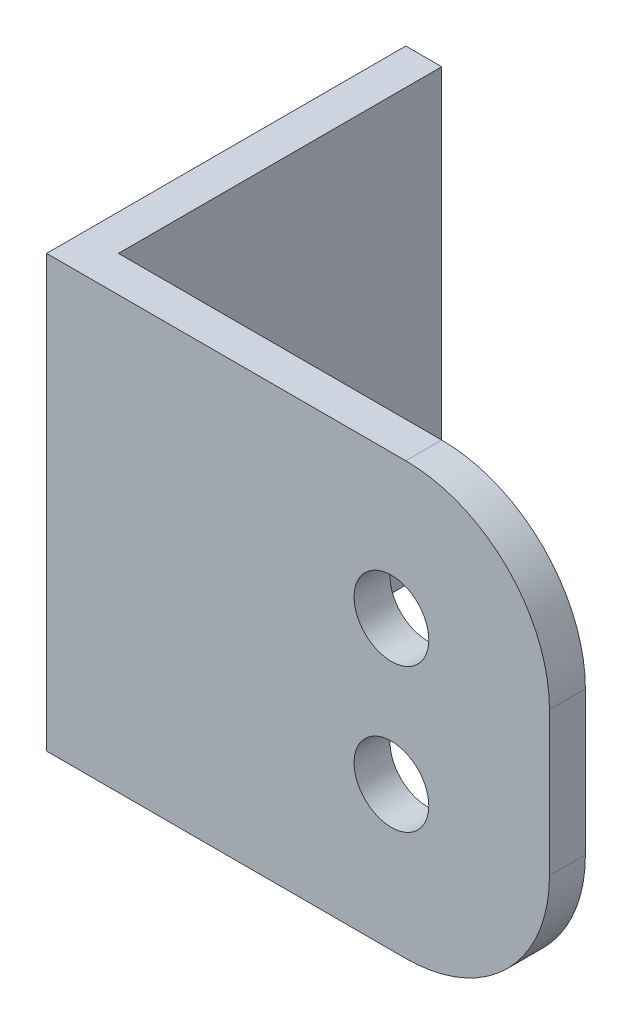
ISO-10303-21;
HEADER;
FILE_DESCRIPTION(('STEP AP214'),'2;1');
FILE_NAME('part.step','',(''),(''),'','','');
FILE_SCHEMA(('AUTOMOTIVE_DESIGN { 1 0 10303 214 1 1 1 1 }'));
ENDSEC;
DATA;
#1=APPLICATION_CONTEXT('core data for automotive mechanical design processes');
#2=APPLICATION_PROTOCOL_DEFINITION('international standard','automotive_design',2000,#1);
#3=PRODUCT_CONTEXT('',#1,'mechanical');
#4=PRODUCT('Part','Part','',(#3));
#5=PRODUCT_RELATED_PRODUCT_CATEGORY('part','',(#4));
#6=PRODUCT_DEFINITION_FORMATION('','',#4);
#7=PRODUCT_DEFINITION_CONTEXT('part definition',#1,'design');
#8=PRODUCT_DEFINITION('design','',#6,#7);
#9=PRODUCT_DEFINITION_SHAPE('','',#8);
#10=(LENGTH_UNIT() NAMED_UNIT(*) SI_UNIT(.MILLI.,.METRE.));
#11=(NAMED_UNIT(*) PLANE_ANGLE_UNIT() SI_UNIT($,.RADIAN.));
#12=(NAMED_UNIT(*) SI_UNIT($,.STERADIAN.) SOLID_ANGLE_UNIT());
#13=UNCERTAINTY_MEASURE_WITH_UNIT(LENGTH_MEASURE(1.E-05),#10,'distance_accuracy_value','');
#14=(GEOMETRIC_REPRESENTATION_CONTEXT(3) GLOBAL_UNCERTAINTY_ASSIGNED_CONTEXT((#13)) GLOBAL_UNIT_ASSIGNED_CONTEXT((#10,
#11,#12)) REPRESENTATION_CONTEXT('',''));
#15=CARTESIAN_POINT('',(0.,0.,0.));
#16=DIRECTION('',(0.,0.,1.));
#17=DIRECTION('',(1.,0.,0.));
#18=AXIS2_PLACEMENT_3D('',#15,#16,#17);
#19=CARTESIAN_POINT('',(0.,0.,0.));
#20=DIRECTION('',(0.,0.,1.));
#21=DIRECTION('',(1.,0.,0.));
#22=AXIS2_PLACEMENT_3D('',#19,#20,#21);
#23=PLANE('',#22);
#24=CARTESIAN_POINT('',(30.48,-6.35,0.));
#25=DIRECTION('',(0.,0.,1.));
#26=DIRECTION('',(1.,0.,0.));
#27=AXIS2_PLACEMENT_3D('',#24,#25,#26);
#28=CIRCLE('',#27,3.30199999999999);
#29=CARTESIAN_POINT('',(33.782,-6.35,0.));
#30=VERTEX_POINT('',#29);
#31=EDGE_CURVE('E145',#30,#30,#28,.T.);
#32=ORIENTED_EDGE('',*,*,#31,.T.);
#33=EDGE_LOOP('',(#32));
#34=FACE_BOUND('',#33,.T.);
#35=CARTESIAN_POINT('',(30.48,6.35,0.));
#36=DIRECTION('',(0.,0.,1.));
#37=DIRECTION('',(1.,0.,0.));
#38=AXIS2_PLACEMENT_3D('',#35,#36,#37);
#39=CIRCLE('',#38,3.30199999999999);
#40=CARTESIAN_POINT('',(33.782,6.35,0.));
#41=VERTEX_POINT('',#40);
#42=EDGE_CURVE('E146',#41,#41,#39,.T.);
#43=ORIENTED_EDGE('',*,*,#42,.T.);
#44=EDGE_LOOP('',(#43));
#45=FACE_BOUND('',#44,.T.);
#46=DIRECTION('',(0.,1.,0.));
#47=VECTOR('',#46,1.);
#48=CARTESIAN_POINT('',(44.45,19.05,0.));
#49=LINE('',#48,#47);
#50=CARTESIAN_POINT('',(44.45,-6.34999999999999,0.));
#51=VERTEX_POINT('',#50);
#52=CARTESIAN_POINT('',(44.45,6.35,0.));
#53=VERTEX_POINT('',#52);
#54=EDGE_CURVE('E166',#51,#53,#49,.T.);
#55=ORIENTED_EDGE('',*,*,#54,.F.);
#56=CARTESIAN_POINT('',(31.75,-6.35,0.));
#57=DIRECTION('',(0.,0.,1.));
#58=DIRECTION('',(1.,0.,0.));
#59=AXIS2_PLACEMENT_3D('',#56,#57,#58);
#60=CIRCLE('',#59,12.7);
#61=CARTESIAN_POINT('',(31.75,-19.05,0.));
#62=VERTEX_POINT('',#61);
#63=EDGE_CURVE('E178',#51,#62,#60,.F.);
#64=ORIENTED_EDGE('',*,*,#63,.T.);
#65=DIRECTION('',(1.,0.,0.));
#66=VECTOR('',#65,1.);
#67=CARTESIAN_POINT('',(0.,-19.05,0.));
#68=LINE('',#67,#66);
#69=CARTESIAN_POINT('',(3.17499999999999,-19.05,0.));
#70=VERTEX_POINT('',#69);
#71=EDGE_CURVE('E157',#70,#62,#68,.T.);
#72=ORIENTED_EDGE('',*,*,#71,.F.);
#73=DIRECTION('',(0.,-1.,0.));
#74=VECTOR('',#73,1.);
#75=CARTESIAN_POINT('',(3.17499999999999,19.05,0.));
#76=LINE('',#75,#74);
#77=CARTESIAN_POINT('',(3.17499999999999,19.05,0.));
#78=VERTEX_POINT('',#77);
#79=EDGE_CURVE('E134',#78,#70,#76,.T.);
#80=ORIENTED_EDGE('',*,*,#79,.F.);
#81=DIRECTION('',(-1.,0.,0.));
#82=VECTOR('',#81,1.);
#83=CARTESIAN_POINT('',(0.,19.05,0.));
#84=LINE('',#83,#82);
#85=CARTESIAN_POINT('',(31.75,19.05,0.));
#86=VERTEX_POINT('',#85);
#87=EDGE_CURVE('E160',#86,#78,#84,.T.);
#88=ORIENTED_EDGE('',*,*,#87,.F.);
#89=CARTESIAN_POINT('',(31.75,6.35,0.));
#90=DIRECTION('',(0.,0.,1.));
#91=DIRECTION('',(1.,0.,0.));
#92=AXIS2_PLACEMENT_3D('',#89,#90,#91);
#93=CIRCLE('',#92,12.7);
#94=EDGE_CURVE('E176',#86,#53,#93,.F.);
#95=ORIENTED_EDGE('',*,*,#94,.T.);
#96=EDGE_LOOP('',(#55,#64,#72,#80,#88,#95));
#97=FACE_BOUND('',#96,.T.);
#98=ADVANCED_FACE('F41',(#34,#45,#97),#23,.F.);
#99=CARTESIAN_POINT('',(0.,19.05,3.175));
#100=DIRECTION('',(1.,0.,0.));
#101=DIRECTION('',(0.,0.,-1.));
#102=AXIS2_PLACEMENT_3D('',#99,#100,#101);
#103=PLANE('',#102);
#104=DIRECTION('',(0.,0.,-1.));
#105=VECTOR('',#104,1.);
#106=CARTESIAN_POINT('',(0.,19.05,3.175));
#107=LINE('',#106,#105);
#108=CARTESIAN_POINT('',(0.,19.05,3.175));
#109=VERTEX_POINT('',#108);
#110=CARTESIAN_POINT('',(0.,19.05,-28.575));
#111=VERTEX_POINT('',#110);
#112=EDGE_CURVE('E109',#109,#111,#107,.T.);
#113=ORIENTED_EDGE('',*,*,#112,.T.);
#114=DIRECTION('',(0.,1.,0.));
#115=VECTOR('',#114,1.);
#116=CARTESIAN_POINT('',(0.,19.05,-28.575));
#117=LINE('',#116,#115);
#118=CARTESIAN_POINT('',(0.,-19.05,-28.575));
#119=VERTEX_POINT('',#118);
#120=EDGE_CURVE('E114',#119,#111,#117,.T.);
#121=ORIENTED_EDGE('',*,*,#120,.F.);
#122=DIRECTION('',(0.,0.,-1.));
#123=VECTOR('',#122,1.);
#124=CARTESIAN_POINT('',(0.,-19.05,3.175));
#125=LINE('',#124,#123);
#126=CARTESIAN_POINT('',(0.,-19.05,3.175));
#127=VERTEX_POINT('',#126);
#128=EDGE_CURVE('E118',#127,#119,#125,.T.);
#129=ORIENTED_EDGE('',*,*,#128,.F.);
#130=DIRECTION('',(0.,-1.,0.));
#131=VECTOR('',#130,1.);
#132=CARTESIAN_POINT('',(0.,19.05,3.175));
#133=LINE('',#132,#131);
#134=EDGE_CURVE('E116',#109,#127,#133,.T.);
#135=ORIENTED_EDGE('',*,*,#134,.F.);
#136=EDGE_LOOP('',(#113,#121,#129,#135));
#137=FACE_BOUND('',#136,.T.);
#138=ADVANCED_FACE('F111',(#137),#103,.F.);
#139=CARTESIAN_POINT('',(0.,-19.05,3.175));
#140=DIRECTION('',(0.,1.,0.));
#141=DIRECTION('',(-1.,0.,0.));
#142=AXIS2_PLACEMENT_3D('',#139,#140,#141);
#143=PLANE('',#142);
#144=ORIENTED_EDGE('',*,*,#71,.T.);
#145=DIRECTION('',(0.,0.,-1.));
#146=VECTOR('',#145,1.);
#147=CARTESIAN_POINT('',(31.75,-19.05,3.175));
#148=LINE('',#147,#146);
#149=CARTESIAN_POINT('',(31.75,-19.05,3.175));
#150=VERTEX_POINT('',#149);
#151=EDGE_CURVE('E64',#62,#150,#148,.F.);
#152=ORIENTED_EDGE('',*,*,#151,.T.);
#153=DIRECTION('',(1.,0.,0.));
#154=VECTOR('',#153,1.);
#155=CARTESIAN_POINT('',(0.,-19.05,3.175));
#156=LINE('',#155,#154);
#157=EDGE_CURVE('E159',#127,#150,#156,.T.);
#158=ORIENTED_EDGE('',*,*,#157,.F.);
#159=ORIENTED_EDGE('',*,*,#128,.T.);
#160=DIRECTION('',(-1.,0.,0.));
#161=VECTOR('',#160,1.);
#162=CARTESIAN_POINT('',(0.,-19.05,-28.575));
#163=LINE('',#162,#161);
#164=CARTESIAN_POINT('',(3.17499999999999,-19.05,-28.575));
#165=VERTEX_POINT('',#164);
#166=EDGE_CURVE('E133',#165,#119,#163,.T.);
#167=ORIENTED_EDGE('',*,*,#166,.F.);
#168=DIRECTION('',(0.,0.,1.));
#169=VECTOR('',#168,1.);
#170=CARTESIAN_POINT('',(3.17499999999999,-19.05,-28.575));
#171=LINE('',#170,#169);
#172=EDGE_CURVE('E140',#165,#70,#171,.T.);
#173=ORIENTED_EDGE('',*,*,#172,.T.);
#174=EDGE_LOOP('',(#144,#152,#158,#159,#167,#173));
#175=FACE_BOUND('',#174,.T.);
#176=ADVANCED_FACE('F193',(#175),#143,.F.);
#177=CARTESIAN_POINT('',(44.45,19.05,3.175));
#178=DIRECTION('',(-1.,0.,0.));
#179=DIRECTION('',(0.,0.,1.));
#180=AXIS2_PLACEMENT_3D('',#177,#178,#179);
#181=PLANE('',#180);
#182=DIRECTION('',(0.,1.,0.));
#183=VECTOR('',#182,1.);
#184=CARTESIAN_POINT('',(44.45,19.05,3.175));
#185=LINE('',#184,#183);
#186=CARTESIAN_POINT('',(44.45,-6.34999999999999,3.175));
#187=VERTEX_POINT('',#186);
#188=CARTESIAN_POINT('',(44.45,6.35,3.175));
#189=VERTEX_POINT('',#188);
#190=EDGE_CURVE('E162',#187,#189,#185,.T.);
#191=ORIENTED_EDGE('',*,*,#190,.F.);
#192=DIRECTION('',(0.,0.,-1.));
#193=VECTOR('',#192,1.);
#194=CARTESIAN_POINT('',(44.45,-6.35,3.175));
#195=LINE('',#194,#193);
#196=EDGE_CURVE('E173',#187,#51,#195,.T.);
#197=ORIENTED_EDGE('',*,*,#196,.T.);
#198=ORIENTED_EDGE('',*,*,#54,.T.);
#199=DIRECTION('',(0.,0.,-1.));
#200=VECTOR('',#199,1.);
#201=CARTESIAN_POINT('',(44.45,6.35,3.175));
#202=LINE('',#201,#200);
#203=EDGE_CURVE('E171',#53,#189,#202,.F.);
#204=ORIENTED_EDGE('',*,*,#203,.T.);
#205=EDGE_LOOP('',(#191,#197,#198,#204));
#206=FACE_BOUND('',#205,.T.);
#207=ADVANCED_FACE('F187',(#206),#181,.F.);
#208=CARTESIAN_POINT('',(0.,19.05,3.175));
#209=DIRECTION('',(0.,-1.,0.));
#210=DIRECTION('',(1.,0.,0.));
#211=AXIS2_PLACEMENT_3D('',#208,#209,#210);
#212=PLANE('',#211);
#213=DIRECTION('',(-1.,0.,0.));
#214=VECTOR('',#213,1.);
#215=CARTESIAN_POINT('',(0.,19.05,3.175));
#216=LINE('',#215,#214);
#217=CARTESIAN_POINT('',(31.75,19.05,3.175));
#218=VERTEX_POINT('',#217);
#219=EDGE_CURVE('E119',#218,#109,#216,.T.);
#220=ORIENTED_EDGE('',*,*,#219,.F.);
#221=DIRECTION('',(0.,0.,-1.));
#222=VECTOR('',#221,1.);
#223=CARTESIAN_POINT('',(31.75,19.05,3.175));
#224=LINE('',#223,#222);
#225=EDGE_CURVE('E11',#218,#86,#224,.T.);
#226=ORIENTED_EDGE('',*,*,#225,.T.);
#227=ORIENTED_EDGE('',*,*,#87,.T.);
#228=DIRECTION('',(0.,0.,1.));
#229=VECTOR('',#228,1.);
#230=CARTESIAN_POINT('',(3.17499999999999,19.05,-28.575));
#231=LINE('',#230,#229);
#232=CARTESIAN_POINT('',(3.17499999999999,19.05,-28.575));
#233=VERTEX_POINT('',#232);
#234=EDGE_CURVE('E125',#233,#78,#231,.T.);
#235=ORIENTED_EDGE('',*,*,#234,.F.);
#236=DIRECTION('',(1.,0.,0.));
#237=VECTOR('',#236,1.);
#238=CARTESIAN_POINT('',(0.,19.05,-28.575));
#239=LINE('',#238,#237);
#240=EDGE_CURVE('E122',#111,#233,#239,.T.);
#241=ORIENTED_EDGE('',*,*,#240,.F.);
#242=ORIENTED_EDGE('',*,*,#112,.F.);
#243=EDGE_LOOP('',(#220,#226,#227,#235,#241,#242));
#244=FACE_BOUND('',#243,.T.);
#245=ADVANCED_FACE('F123',(#244),#212,.F.);
#246=CARTESIAN_POINT('',(0.,0.,3.175));
#247=DIRECTION('',(0.,0.,1.));
#248=DIRECTION('',(1.,0.,0.));
#249=AXIS2_PLACEMENT_3D('',#246,#247,#248);
#250=PLANE('',#249);
#251=CARTESIAN_POINT('',(30.48,6.35,3.175));
#252=DIRECTION('',(0.,0.,1.));
#253=DIRECTION('',(1.,0.,0.));
#254=AXIS2_PLACEMENT_3D('',#251,#252,#253);
#255=CIRCLE('',#254,3.30199999999999);
#256=CARTESIAN_POINT('',(33.782,6.35,3.175));
#257=VERTEX_POINT('',#256);
#258=EDGE_CURVE('E154',#257,#257,#255,.T.);
#259=ORIENTED_EDGE('',*,*,#258,.F.);
#260=EDGE_LOOP('',(#259));
#261=FACE_BOUND('',#260,.T.);
#262=CARTESIAN_POINT('',(30.48,-6.35,3.175));
#263=DIRECTION('',(0.,0.,1.));
#264=DIRECTION('',(1.,0.,0.));
#265=AXIS2_PLACEMENT_3D('',#262,#263,#264);
#266=CIRCLE('',#265,3.30199999999999);
#267=CARTESIAN_POINT('',(33.782,-6.35,3.175));
#268=VERTEX_POINT('',#267);
#269=EDGE_CURVE('E149',#268,#268,#266,.T.);
#270=ORIENTED_EDGE('',*,*,#269,.F.);
#271=EDGE_LOOP('',(#270));
#272=FACE_BOUND('',#271,.T.);
#273=ORIENTED_EDGE('',*,*,#157,.T.);
#274=CARTESIAN_POINT('',(31.75,-6.35,3.175));
#275=DIRECTION('',(0.,0.,1.));
#276=DIRECTION('',(1.,0.,0.));
#277=AXIS2_PLACEMENT_3D('',#274,#275,#276);
#278=CIRCLE('',#277,12.7);
#279=EDGE_CURVE('E49',#150,#187,#278,.T.);
#280=ORIENTED_EDGE('',*,*,#279,.T.);
#281=ORIENTED_EDGE('',*,*,#190,.T.);
#282=CARTESIAN_POINT('',(31.75,6.35,3.175));
#283=DIRECTION('',(0.,0.,1.));
#284=DIRECTION('',(1.,0.,0.));
#285=AXIS2_PLACEMENT_3D('',#282,#283,#284);
#286=CIRCLE('',#285,12.7);
#287=EDGE_CURVE('E56',#189,#218,#286,.T.);
#288=ORIENTED_EDGE('',*,*,#287,.T.);
#289=ORIENTED_EDGE('',*,*,#219,.T.);
#290=ORIENTED_EDGE('',*,*,#134,.T.);
#291=EDGE_LOOP('',(#273,#280,#281,#288,#289,#290));
#292=FACE_BOUND('',#291,.T.);
#293=ADVANCED_FACE('F183',(#261,#272,#292),#250,.T.);
#294=CARTESIAN_POINT('',(30.48,-6.35,0.));
#295=DIRECTION('',(0.,0.,1.));
#296=DIRECTION('',(1.,0.,0.));
#297=AXIS2_PLACEMENT_3D('',#294,#295,#296);
#298=CYLINDRICAL_SURFACE('',#297,3.30199999999999);
#299=ORIENTED_EDGE('',*,*,#269,.T.);
#300=EDGE_LOOP('',(#299));
#301=FACE_BOUND('',#300,.T.);
#302=ORIENTED_EDGE('',*,*,#31,.F.);
#303=EDGE_LOOP('',(#302));
#304=FACE_BOUND('',#303,.T.);
#305=ADVANCED_FACE('F241',(#301,#304),#298,.F.);
#306=CARTESIAN_POINT('',(30.48,6.35,0.));
#307=DIRECTION('',(0.,0.,1.));
#308=DIRECTION('',(1.,0.,0.));
#309=AXIS2_PLACEMENT_3D('',#306,#307,#308);
#310=CYLINDRICAL_SURFACE('',#309,3.30199999999999);
#311=ORIENTED_EDGE('',*,*,#258,.T.);
#312=EDGE_LOOP('',(#311));
#313=FACE_BOUND('',#312,.T.);
#314=ORIENTED_EDGE('',*,*,#42,.F.);
#315=EDGE_LOOP('',(#314));
#316=FACE_BOUND('',#315,.T.);
#317=ADVANCED_FACE('F268',(#313,#316),#310,.F.);
#318=CARTESIAN_POINT('',(3.17499999999999,19.05,-28.575));
#319=DIRECTION('',(-1.,0.,0.));
#320=DIRECTION('',(0.,0.,1.));
#321=AXIS2_PLACEMENT_3D('',#318,#319,#320);
#322=PLANE('',#321);
#323=ORIENTED_EDGE('',*,*,#79,.T.);
#324=ORIENTED_EDGE('',*,*,#172,.F.);
#325=DIRECTION('',(0.,-1.,0.));
#326=VECTOR('',#325,1.);
#327=CARTESIAN_POINT('',(3.17499999999999,19.05,-28.575));
#328=LINE('',#327,#326);
#329=EDGE_CURVE('E128',#233,#165,#328,.T.);
#330=ORIENTED_EDGE('',*,*,#329,.F.);
#331=ORIENTED_EDGE('',*,*,#234,.T.);
#332=EDGE_LOOP('',(#323,#324,#330,#331));
#333=FACE_BOUND('',#332,.T.);
#334=ADVANCED_FACE('F196',(#333),#322,.F.);
#335=CARTESIAN_POINT('',(0.,0.,-28.575));
#336=DIRECTION('',(0.,0.,1.));
#337=DIRECTION('',(1.,0.,0.));
#338=AXIS2_PLACEMENT_3D('',#335,#336,#337);
#339=PLANE('',#338);
#340=ORIENTED_EDGE('',*,*,#120,.T.);
#341=ORIENTED_EDGE('',*,*,#240,.T.);
#342=ORIENTED_EDGE('',*,*,#329,.T.);
#343=ORIENTED_EDGE('',*,*,#166,.T.);
#344=EDGE_LOOP('',(#340,#341,#342,#343));
#345=FACE_BOUND('',#344,.T.);
#346=ADVANCED_FACE('F131',(#345),#339,.F.);
#347=CARTESIAN_POINT('',(31.75,-6.35,3.175));
#348=DIRECTION('',(0.,0.,-1.));
#349=DIRECTION('',(-1.,0.,0.));
#350=AXIS2_PLACEMENT_3D('',#347,#348,#349);
#351=CYLINDRICAL_SURFACE('',#350,12.7);
#352=ORIENTED_EDGE('',*,*,#279,.F.);
#353=ORIENTED_EDGE('',*,*,#151,.F.);
#354=ORIENTED_EDGE('',*,*,#63,.F.);
#355=ORIENTED_EDGE('',*,*,#196,.F.);
#356=EDGE_LOOP('',(#352,#353,#354,#355));
#357=FACE_BOUND('',#356,.T.);
#358=ADVANCED_FACE('F190',(#357),#351,.T.);
#359=CARTESIAN_POINT('',(31.75,6.35,3.175));
#360=DIRECTION('',(0.,0.,-1.));
#361=DIRECTION('',(-1.,0.,0.));
#362=AXIS2_PLACEMENT_3D('',#359,#360,#361);
#363=CYLINDRICAL_SURFACE('',#362,12.7);
#364=ORIENTED_EDGE('',*,*,#287,.F.);
#365=ORIENTED_EDGE('',*,*,#203,.F.);
#366=ORIENTED_EDGE('',*,*,#94,.F.);
#367=ORIENTED_EDGE('',*,*,#225,.F.);
#368=EDGE_LOOP('',(#364,#365,#366,#367));
#369=FACE_BOUND('',#368,.T.);
#370=ADVANCED_FACE('F43',(#369),#363,.T.);
#371=CLOSED_SHELL('',(#98,#138,#176,#207,#245,#293,#305,#317,#334,#346,#358,#370));
#372=MANIFOLD_SOLID_BREP('B2',#371);
#373=ADVANCED_BREP_SHAPE_REPRESENTATION('',(#18,#372),#14);
#374=SHAPE_DEFINITION_REPRESENTATION(#9,#373);
ENDSEC;
END-ISO-10303-21;
